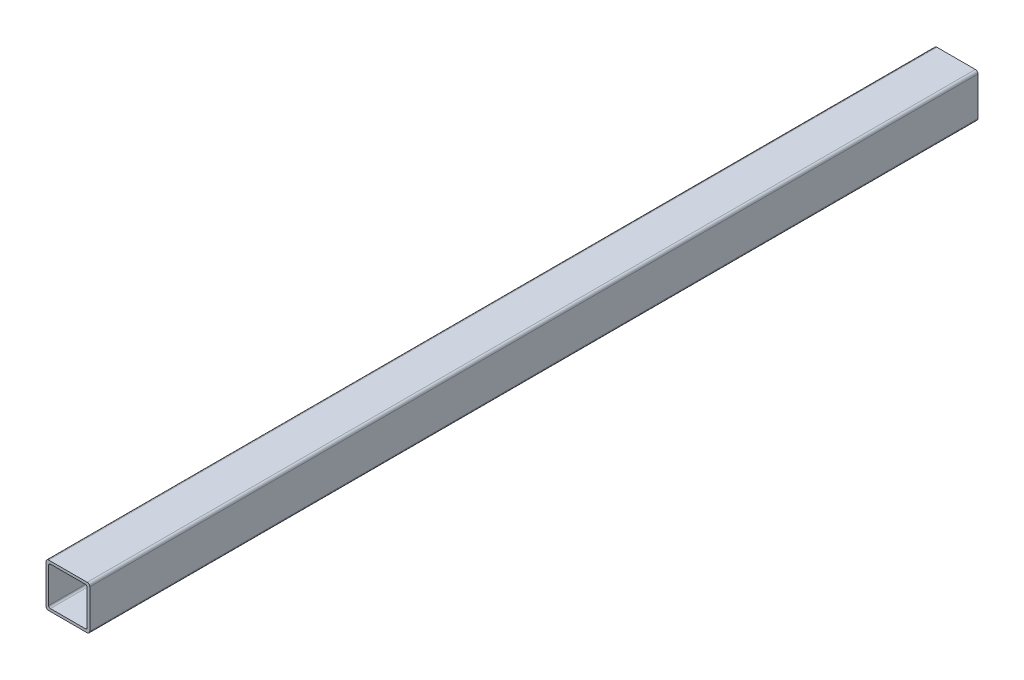
ISO-10303-21;
HEADER;
FILE_DESCRIPTION(('STEP AP214'),'2;1');
FILE_NAME('part.step','',(''),(''),'','','');
FILE_SCHEMA(('AUTOMOTIVE_DESIGN { 1 0 10303 214 1 1 1 1 }'));
ENDSEC;
DATA;
#1=APPLICATION_CONTEXT('core data for automotive mechanical design processes');
#2=APPLICATION_PROTOCOL_DEFINITION('international standard','automotive_design',2000,#1);
#3=PRODUCT_CONTEXT('',#1,'mechanical');
#4=PRODUCT('Part','Part','',(#3));
#5=PRODUCT_RELATED_PRODUCT_CATEGORY('part','',(#4));
#6=PRODUCT_DEFINITION_FORMATION('','',#4);
#7=PRODUCT_DEFINITION_CONTEXT('part definition',#1,'design');
#8=PRODUCT_DEFINITION('design','',#6,#7);
#9=PRODUCT_DEFINITION_SHAPE('','',#8);
#10=(LENGTH_UNIT() NAMED_UNIT(*) SI_UNIT(.MILLI.,.METRE.));
#11=(NAMED_UNIT(*) PLANE_ANGLE_UNIT() SI_UNIT($,.RADIAN.));
#12=(NAMED_UNIT(*) SI_UNIT($,.STERADIAN.) SOLID_ANGLE_UNIT());
#13=UNCERTAINTY_MEASURE_WITH_UNIT(LENGTH_MEASURE(1.E-05),#10,'distance_accuracy_value','');
#14=(GEOMETRIC_REPRESENTATION_CONTEXT(3) GLOBAL_UNCERTAINTY_ASSIGNED_CONTEXT((#13)) GLOBAL_UNIT_ASSIGNED_CONTEXT((#10,
#11,#12)) REPRESENTATION_CONTEXT('',''));
#15=CARTESIAN_POINT('',(0.,0.,0.));
#16=DIRECTION('',(0.,0.,1.));
#17=DIRECTION('',(1.,0.,0.));
#18=AXIS2_PLACEMENT_3D('',#15,#16,#17);
#19=CARTESIAN_POINT('',(-22.,-25.,-1085.71067811867));
#20=DIRECTION('',(0.,-1.,0.));
#21=DIRECTION('',(0.,0.,-1.));
#22=AXIS2_PLACEMENT_3D('',#19,#20,#21);
#23=PLANE('',#22);
#24=DIRECTION('',(-1.,0.,0.));
#25=VECTOR('',#24,1.);
#26=CARTESIAN_POINT('',(-22.,-25.,-1015.00000000002));
#27=LINE('',#26,#25);
#28=CARTESIAN_POINT('',(22.,-25.,-1015.00000000002));
#29=VERTEX_POINT('',#28);
#30=CARTESIAN_POINT('',(-22.,-25.,-1015.00000000002));
#31=VERTEX_POINT('',#30);
#32=EDGE_CURVE('E11',#29,#31,#27,.T.);
#33=ORIENTED_EDGE('',*,*,#32,.F.);
#34=DIRECTION('',(0.,0.,1.));
#35=VECTOR('',#34,1.);
#36=CARTESIAN_POINT('',(22.,-25.,-1085.71067811867));
#37=LINE('',#36,#35);
#38=CARTESIAN_POINT('',(22.,-25.,0.));
#39=VERTEX_POINT('',#38);
#40=EDGE_CURVE('E234',#29,#39,#37,.T.);
#41=ORIENTED_EDGE('',*,*,#40,.T.);
#42=DIRECTION('',(1.,0.,0.));
#43=VECTOR('',#42,1.);
#44=CARTESIAN_POINT('',(-22.,-25.,0.));
#45=LINE('',#44,#43);
#46=CARTESIAN_POINT('',(-22.,-25.,0.));
#47=VERTEX_POINT('',#46);
#48=EDGE_CURVE('E200',#47,#39,#45,.T.);
#49=ORIENTED_EDGE('',*,*,#48,.F.);
#50=DIRECTION('',(0.,0.,1.));
#51=VECTOR('',#50,1.);
#52=CARTESIAN_POINT('',(-22.,-25.,-1085.71067811867));
#53=LINE('',#52,#51);
#54=EDGE_CURVE('E221',#31,#47,#53,.T.);
#55=ORIENTED_EDGE('',*,*,#54,.F.);
#56=EDGE_LOOP('',(#33,#41,#49,#55));
#57=FACE_BOUND('',#56,.T.);
#58=ADVANCED_FACE('F35',(#57),#23,.T.);
#59=CARTESIAN_POINT('',(22.,-22.,-1085.71067811867));
#60=DIRECTION('',(0.,0.,1.));
#61=DIRECTION('',(1.,0.,0.));
#62=AXIS2_PLACEMENT_3D('',#59,#60,#61);
#63=CYLINDRICAL_SURFACE('',#62,3.);
#64=CARTESIAN_POINT('',(22.,-22.,-1015.00000000002));
#65=DIRECTION('',(0.,0.,1.));
#66=DIRECTION('',(1.,0.,0.));
#67=AXIS2_PLACEMENT_3D('',#64,#65,#66);
#68=CIRCLE('',#67,3.);
#69=CARTESIAN_POINT('',(25.,-22.,-1015.00000000002));
#70=VERTEX_POINT('',#69);
#71=EDGE_CURVE('E301',#70,#29,#68,.F.);
#72=ORIENTED_EDGE('',*,*,#71,.F.);
#73=DIRECTION('',(0.,0.,1.));
#74=VECTOR('',#73,1.);
#75=CARTESIAN_POINT('',(25.,-22.,-1085.71067811867));
#76=LINE('',#75,#74);
#77=CARTESIAN_POINT('',(25.,-22.,0.));
#78=VERTEX_POINT('',#77);
#79=EDGE_CURVE('E232',#70,#78,#76,.T.);
#80=ORIENTED_EDGE('',*,*,#79,.T.);
#81=CARTESIAN_POINT('',(22.,-22.,0.));
#82=DIRECTION('',(0.,0.,1.));
#83=DIRECTION('',(1.,0.,0.));
#84=AXIS2_PLACEMENT_3D('',#81,#82,#83);
#85=CIRCLE('',#84,3.);
#86=EDGE_CURVE('E203',#39,#78,#85,.T.);
#87=ORIENTED_EDGE('',*,*,#86,.F.);
#88=ORIENTED_EDGE('',*,*,#40,.F.);
#89=EDGE_LOOP('',(#72,#80,#87,#88));
#90=FACE_BOUND('',#89,.T.);
#91=ADVANCED_FACE('F325',(#90),#63,.T.);
#92=CARTESIAN_POINT('',(25.,22.,-1085.71067811867));
#93=DIRECTION('',(1.,0.,0.));
#94=DIRECTION('',(0.,0.,-1.));
#95=AXIS2_PLACEMENT_3D('',#92,#93,#94);
#96=PLANE('',#95);
#97=DIRECTION('',(0.,-1.,0.));
#98=VECTOR('',#97,1.);
#99=CARTESIAN_POINT('',(25.,22.,-1015.00000000002));
#100=LINE('',#99,#98);
#101=CARTESIAN_POINT('',(25.,22.,-1015.00000000002));
#102=VERTEX_POINT('',#101);
#103=EDGE_CURVE('E303',#102,#70,#100,.T.);
#104=ORIENTED_EDGE('',*,*,#103,.F.);
#105=DIRECTION('',(0.,0.,1.));
#106=VECTOR('',#105,1.);
#107=CARTESIAN_POINT('',(25.,22.,-1085.71067811867));
#108=LINE('',#107,#106);
#109=CARTESIAN_POINT('',(25.,22.,0.));
#110=VERTEX_POINT('',#109);
#111=EDGE_CURVE('E230',#102,#110,#108,.T.);
#112=ORIENTED_EDGE('',*,*,#111,.T.);
#113=DIRECTION('',(0.,1.,0.));
#114=VECTOR('',#113,1.);
#115=CARTESIAN_POINT('',(25.,22.,0.));
#116=LINE('',#115,#114);
#117=EDGE_CURVE('E206',#78,#110,#116,.T.);
#118=ORIENTED_EDGE('',*,*,#117,.F.);
#119=ORIENTED_EDGE('',*,*,#79,.F.);
#120=EDGE_LOOP('',(#104,#112,#118,#119));
#121=FACE_BOUND('',#120,.T.);
#122=ADVANCED_FACE('F322',(#121),#96,.T.);
#123=CARTESIAN_POINT('',(22.,22.,-1085.71067811867));
#124=DIRECTION('',(0.,0.,1.));
#125=DIRECTION('',(1.,0.,0.));
#126=AXIS2_PLACEMENT_3D('',#123,#124,#125);
#127=CYLINDRICAL_SURFACE('',#126,3.00000000000001);
#128=CARTESIAN_POINT('',(22.,22.,-1015.00000000002));
#129=DIRECTION('',(0.,0.,1.));
#130=DIRECTION('',(1.,0.,0.));
#131=AXIS2_PLACEMENT_3D('',#128,#129,#130);
#132=CIRCLE('',#131,3.00000000000001);
#133=CARTESIAN_POINT('',(22.,25.,-1015.00000000002));
#134=VERTEX_POINT('',#133);
#135=EDGE_CURVE('E305',#134,#102,#132,.F.);
#136=ORIENTED_EDGE('',*,*,#135,.F.);
#137=DIRECTION('',(0.,0.,1.));
#138=VECTOR('',#137,1.);
#139=CARTESIAN_POINT('',(22.,25.,-1085.71067811867));
#140=LINE('',#139,#138);
#141=CARTESIAN_POINT('',(22.,25.,0.));
#142=VERTEX_POINT('',#141);
#143=EDGE_CURVE('E228',#134,#142,#140,.T.);
#144=ORIENTED_EDGE('',*,*,#143,.T.);
#145=CARTESIAN_POINT('',(22.,22.,0.));
#146=DIRECTION('',(0.,0.,1.));
#147=DIRECTION('',(-1.,0.,0.));
#148=AXIS2_PLACEMENT_3D('',#145,#146,#147);
#149=CIRCLE('',#148,3.00000000000001);
#150=EDGE_CURVE('E209',#110,#142,#149,.T.);
#151=ORIENTED_EDGE('',*,*,#150,.F.);
#152=ORIENTED_EDGE('',*,*,#111,.F.);
#153=EDGE_LOOP('',(#136,#144,#151,#152));
#154=FACE_BOUND('',#153,.T.);
#155=ADVANCED_FACE('F315',(#154),#127,.T.);
#156=CARTESIAN_POINT('',(-22.,25.,-1085.71067811867));
#157=DIRECTION('',(0.,1.,0.));
#158=DIRECTION('',(-1.,0.,0.));
#159=AXIS2_PLACEMENT_3D('',#156,#157,#158);
#160=PLANE('',#159);
#161=DIRECTION('',(1.,0.,0.));
#162=VECTOR('',#161,1.);
#163=CARTESIAN_POINT('',(-22.,25.,-1015.00000000002));
#164=LINE('',#163,#162);
#165=CARTESIAN_POINT('',(-22.,25.,-1015.00000000002));
#166=VERTEX_POINT('',#165);
#167=EDGE_CURVE('E259',#166,#134,#164,.T.);
#168=ORIENTED_EDGE('',*,*,#167,.F.);
#169=DIRECTION('',(0.,0.,1.));
#170=VECTOR('',#169,1.);
#171=CARTESIAN_POINT('',(-22.,25.,-1085.71067811867));
#172=LINE('',#171,#170);
#173=CARTESIAN_POINT('',(-22.,25.,0.));
#174=VERTEX_POINT('',#173);
#175=EDGE_CURVE('E226',#166,#174,#172,.T.);
#176=ORIENTED_EDGE('',*,*,#175,.T.);
#177=DIRECTION('',(-1.,0.,0.));
#178=VECTOR('',#177,1.);
#179=CARTESIAN_POINT('',(-22.,25.,0.));
#180=LINE('',#179,#178);
#181=EDGE_CURVE('E212',#142,#174,#180,.T.);
#182=ORIENTED_EDGE('',*,*,#181,.F.);
#183=ORIENTED_EDGE('',*,*,#143,.F.);
#184=EDGE_LOOP('',(#168,#176,#182,#183));
#185=FACE_BOUND('',#184,.T.);
#186=ADVANCED_FACE('F318',(#185),#160,.T.);
#187=CARTESIAN_POINT('',(-22.,22.,-1085.71067811867));
#188=DIRECTION('',(0.,0.,1.));
#189=DIRECTION('',(1.,0.,0.));
#190=AXIS2_PLACEMENT_3D('',#187,#188,#189);
#191=CYLINDRICAL_SURFACE('',#190,3.);
#192=CARTESIAN_POINT('',(-22.,22.,-1015.00000000002));
#193=DIRECTION('',(0.,0.,1.));
#194=DIRECTION('',(1.,0.,0.));
#195=AXIS2_PLACEMENT_3D('',#192,#193,#194);
#196=CIRCLE('',#195,3.);
#197=CARTESIAN_POINT('',(-25.,22.,-1015.00000000002));
#198=VERTEX_POINT('',#197);
#199=EDGE_CURVE('E255',#198,#166,#196,.F.);
#200=ORIENTED_EDGE('',*,*,#199,.F.);
#201=DIRECTION('',(0.,0.,1.));
#202=VECTOR('',#201,1.);
#203=CARTESIAN_POINT('',(-25.,22.,-1085.71067811867));
#204=LINE('',#203,#202);
#205=CARTESIAN_POINT('',(-25.,22.,0.));
#206=VERTEX_POINT('',#205);
#207=EDGE_CURVE('E224',#198,#206,#204,.T.);
#208=ORIENTED_EDGE('',*,*,#207,.T.);
#209=CARTESIAN_POINT('',(-22.,22.,0.));
#210=DIRECTION('',(0.,0.,1.));
#211=DIRECTION('',(1.,0.,0.));
#212=AXIS2_PLACEMENT_3D('',#209,#210,#211);
#213=CIRCLE('',#212,3.);
#214=EDGE_CURVE('E215',#174,#206,#213,.T.);
#215=ORIENTED_EDGE('',*,*,#214,.F.);
#216=ORIENTED_EDGE('',*,*,#175,.F.);
#217=EDGE_LOOP('',(#200,#208,#215,#216));
#218=FACE_BOUND('',#217,.T.);
#219=ADVANCED_FACE('F338',(#218),#191,.T.);
#220=CARTESIAN_POINT('',(-25.,22.,-1085.71067811867));
#221=DIRECTION('',(-1.,0.,0.));
#222=DIRECTION('',(0.,0.,1.));
#223=AXIS2_PLACEMENT_3D('',#220,#221,#222);
#224=PLANE('',#223);
#225=DIRECTION('',(0.,1.,0.));
#226=VECTOR('',#225,1.);
#227=CARTESIAN_POINT('',(-25.,22.,-1015.00000000002));
#228=LINE('',#227,#226);
#229=CARTESIAN_POINT('',(-25.,-22.,-1015.00000000002));
#230=VERTEX_POINT('',#229);
#231=EDGE_CURVE('E252',#230,#198,#228,.T.);
#232=ORIENTED_EDGE('',*,*,#231,.F.);
#233=DIRECTION('',(0.,0.,1.));
#234=VECTOR('',#233,1.);
#235=CARTESIAN_POINT('',(-25.,-22.,-1085.71067811867));
#236=LINE('',#235,#234);
#237=CARTESIAN_POINT('',(-25.,-22.,0.));
#238=VERTEX_POINT('',#237);
#239=EDGE_CURVE('E222',#230,#238,#236,.T.);
#240=ORIENTED_EDGE('',*,*,#239,.T.);
#241=DIRECTION('',(0.,-1.,0.));
#242=VECTOR('',#241,1.);
#243=CARTESIAN_POINT('',(-25.,22.,0.));
#244=LINE('',#243,#242);
#245=EDGE_CURVE('E218',#206,#238,#244,.T.);
#246=ORIENTED_EDGE('',*,*,#245,.F.);
#247=ORIENTED_EDGE('',*,*,#207,.F.);
#248=EDGE_LOOP('',(#232,#240,#246,#247));
#249=FACE_BOUND('',#248,.T.);
#250=ADVANCED_FACE('F251',(#249),#224,.T.);
#251=CARTESIAN_POINT('',(-22.,-22.,-1085.71067811867));
#252=DIRECTION('',(0.,0.,1.));
#253=DIRECTION('',(1.,0.,0.));
#254=AXIS2_PLACEMENT_3D('',#251,#252,#253);
#255=CYLINDRICAL_SURFACE('',#254,3.);
#256=CARTESIAN_POINT('',(-22.,-22.,-1015.00000000002));
#257=DIRECTION('',(0.,0.,1.));
#258=DIRECTION('',(1.,0.,0.));
#259=AXIS2_PLACEMENT_3D('',#256,#257,#258);
#260=CIRCLE('',#259,3.);
#261=EDGE_CURVE('E241',#31,#230,#260,.F.);
#262=ORIENTED_EDGE('',*,*,#261,.F.);
#263=ORIENTED_EDGE('',*,*,#54,.T.);
#264=CARTESIAN_POINT('',(-22.,-22.,0.));
#265=DIRECTION('',(0.,0.,1.));
#266=DIRECTION('',(1.,0.,0.));
#267=AXIS2_PLACEMENT_3D('',#264,#265,#266);
#268=CIRCLE('',#267,3.);
#269=EDGE_CURVE('E187',#238,#47,#268,.T.);
#270=ORIENTED_EDGE('',*,*,#269,.F.);
#271=ORIENTED_EDGE('',*,*,#239,.F.);
#272=EDGE_LOOP('',(#262,#263,#270,#271));
#273=FACE_BOUND('',#272,.T.);
#274=ADVANCED_FACE('F37',(#273),#255,.T.);
#275=CARTESIAN_POINT('',(-22.,-22.,0.));
#276=DIRECTION('',(0.,0.,1.));
#277=DIRECTION('',(1.,0.,0.));
#278=AXIS2_PLACEMENT_3D('',#275,#276,#277);
#279=PLANE('',#278);
#280=CARTESIAN_POINT('',(-20.,-20.,0.));
#281=DIRECTION('',(0.,0.,1.));
#282=DIRECTION('',(1.,0.,0.));
#283=AXIS2_PLACEMENT_3D('',#280,#281,#282);
#284=CIRCLE('',#283,2.);
#285=CARTESIAN_POINT('',(-22.,-20.,0.));
#286=VERTEX_POINT('',#285);
#287=CARTESIAN_POINT('',(-20.,-22.,0.));
#288=VERTEX_POINT('',#287);
#289=EDGE_CURVE('E162',#286,#288,#284,.T.);
#290=ORIENTED_EDGE('',*,*,#289,.F.);
#291=DIRECTION('',(0.,-1.,0.));
#292=VECTOR('',#291,1.);
#293=CARTESIAN_POINT('',(-22.,20.,0.));
#294=LINE('',#293,#292);
#295=CARTESIAN_POINT('',(-22.,20.,0.));
#296=VERTEX_POINT('',#295);
#297=EDGE_CURVE('E182',#296,#286,#294,.T.);
#298=ORIENTED_EDGE('',*,*,#297,.F.);
#299=CARTESIAN_POINT('',(-20.,20.,0.));
#300=DIRECTION('',(0.,0.,1.));
#301=DIRECTION('',(1.,0.,0.));
#302=AXIS2_PLACEMENT_3D('',#299,#300,#301);
#303=CIRCLE('',#302,2.);
#304=CARTESIAN_POINT('',(-20.,22.,0.));
#305=VERTEX_POINT('',#304);
#306=EDGE_CURVE('E179',#305,#296,#303,.T.);
#307=ORIENTED_EDGE('',*,*,#306,.F.);
#308=DIRECTION('',(-1.,0.,0.));
#309=VECTOR('',#308,1.);
#310=CARTESIAN_POINT('',(-20.,22.,0.));
#311=LINE('',#310,#309);
#312=CARTESIAN_POINT('',(20.,22.,0.));
#313=VERTEX_POINT('',#312);
#314=EDGE_CURVE('E176',#313,#305,#311,.T.);
#315=ORIENTED_EDGE('',*,*,#314,.F.);
#316=CARTESIAN_POINT('',(20.,20.,0.));
#317=DIRECTION('',(0.,0.,1.));
#318=DIRECTION('',(-1.,0.,0.));
#319=AXIS2_PLACEMENT_3D('',#316,#317,#318);
#320=CIRCLE('',#319,2.);
#321=CARTESIAN_POINT('',(22.,20.,0.));
#322=VERTEX_POINT('',#321);
#323=EDGE_CURVE('E170',#322,#313,#320,.T.);
#324=ORIENTED_EDGE('',*,*,#323,.F.);
#325=DIRECTION('',(0.,1.,0.));
#326=VECTOR('',#325,1.);
#327=CARTESIAN_POINT('',(22.,20.,0.));
#328=LINE('',#327,#326);
#329=CARTESIAN_POINT('',(22.,-20.,0.));
#330=VERTEX_POINT('',#329);
#331=EDGE_CURVE('E168',#330,#322,#328,.T.);
#332=ORIENTED_EDGE('',*,*,#331,.F.);
#333=CARTESIAN_POINT('',(20.,-20.,0.));
#334=DIRECTION('',(0.,0.,1.));
#335=DIRECTION('',(1.,0.,0.));
#336=AXIS2_PLACEMENT_3D('',#333,#334,#335);
#337=CIRCLE('',#336,2.);
#338=CARTESIAN_POINT('',(20.,-22.,0.));
#339=VERTEX_POINT('',#338);
#340=EDGE_CURVE('E149',#339,#330,#337,.T.);
#341=ORIENTED_EDGE('',*,*,#340,.F.);
#342=DIRECTION('',(1.,0.,0.));
#343=VECTOR('',#342,1.);
#344=CARTESIAN_POINT('',(-20.,-22.,0.));
#345=LINE('',#344,#343);
#346=EDGE_CURVE('E156',#288,#339,#345,.T.);
#347=ORIENTED_EDGE('',*,*,#346,.F.);
#348=EDGE_LOOP('',(#290,#298,#307,#315,#324,#332,#341,#347));
#349=FACE_BOUND('',#348,.T.);
#350=ORIENTED_EDGE('',*,*,#269,.T.);
#351=ORIENTED_EDGE('',*,*,#48,.T.);
#352=ORIENTED_EDGE('',*,*,#86,.T.);
#353=ORIENTED_EDGE('',*,*,#117,.T.);
#354=ORIENTED_EDGE('',*,*,#150,.T.);
#355=ORIENTED_EDGE('',*,*,#181,.T.);
#356=ORIENTED_EDGE('',*,*,#214,.T.);
#357=ORIENTED_EDGE('',*,*,#245,.T.);
#358=EDGE_LOOP('',(#350,#351,#352,#353,#354,#355,#356,#357));
#359=FACE_BOUND('',#358,.T.);
#360=ADVANCED_FACE('F164',(#349,#359),#279,.T.);
#361=CARTESIAN_POINT('',(-20.,-22.,-1085.71067811867));
#362=DIRECTION('',(0.,-1.,0.));
#363=DIRECTION('',(0.,0.,-1.));
#364=AXIS2_PLACEMENT_3D('',#361,#362,#363);
#365=PLANE('',#364);
#366=DIRECTION('',(0.,0.,1.));
#367=VECTOR('',#366,1.);
#368=CARTESIAN_POINT('',(20.,-22.,-1085.71067811867));
#369=LINE('',#368,#367);
#370=CARTESIAN_POINT('',(20.,-22.,-1015.00000000002));
#371=VERTEX_POINT('',#370);
#372=EDGE_CURVE('E145',#371,#339,#369,.T.);
#373=ORIENTED_EDGE('',*,*,#372,.F.);
#374=DIRECTION('',(-1.,0.,0.));
#375=VECTOR('',#374,1.);
#376=CARTESIAN_POINT('',(-20.,-22.,-1015.00000000002));
#377=LINE('',#376,#375);
#378=CARTESIAN_POINT('',(-20.,-22.,-1015.00000000002));
#379=VERTEX_POINT('',#378);
#380=EDGE_CURVE('E39',#371,#379,#377,.T.);
#381=ORIENTED_EDGE('',*,*,#380,.T.);
#382=DIRECTION('',(0.,0.,1.));
#383=VECTOR('',#382,1.);
#384=CARTESIAN_POINT('',(-20.,-22.,-1085.71067811867));
#385=LINE('',#384,#383);
#386=EDGE_CURVE('E153',#379,#288,#385,.T.);
#387=ORIENTED_EDGE('',*,*,#386,.T.);
#388=ORIENTED_EDGE('',*,*,#346,.T.);
#389=EDGE_LOOP('',(#373,#381,#387,#388));
#390=FACE_BOUND('',#389,.T.);
#391=ADVANCED_FACE('F157',(#390),#365,.F.);
#392=CARTESIAN_POINT('',(20.,-20.,-1085.71067811867));
#393=DIRECTION('',(0.,0.,1.));
#394=DIRECTION('',(1.,0.,0.));
#395=AXIS2_PLACEMENT_3D('',#392,#393,#394);
#396=CYLINDRICAL_SURFACE('',#395,2.);
#397=DIRECTION('',(0.,0.,1.));
#398=VECTOR('',#397,1.);
#399=CARTESIAN_POINT('',(22.,-20.,-1085.71067811867));
#400=LINE('',#399,#398);
#401=CARTESIAN_POINT('',(22.,-20.,-1015.00000000002));
#402=VERTEX_POINT('',#401);
#403=EDGE_CURVE('E152',#402,#330,#400,.T.);
#404=ORIENTED_EDGE('',*,*,#403,.F.);
#405=CARTESIAN_POINT('',(20.,-20.,-1015.00000000002));
#406=DIRECTION('',(0.,0.,1.));
#407=DIRECTION('',(1.,0.,0.));
#408=AXIS2_PLACEMENT_3D('',#405,#406,#407);
#409=CIRCLE('',#408,2.);
#410=EDGE_CURVE('E44',#402,#371,#409,.F.);
#411=ORIENTED_EDGE('',*,*,#410,.T.);
#412=ORIENTED_EDGE('',*,*,#372,.T.);
#413=ORIENTED_EDGE('',*,*,#340,.T.);
#414=EDGE_LOOP('',(#404,#411,#412,#413));
#415=FACE_BOUND('',#414,.T.);
#416=ADVANCED_FACE('F147',(#415),#396,.F.);
#417=CARTESIAN_POINT('',(22.,20.,-1085.71067811867));
#418=DIRECTION('',(1.,0.,0.));
#419=DIRECTION('',(0.,0.,-1.));
#420=AXIS2_PLACEMENT_3D('',#417,#418,#419);
#421=PLANE('',#420);
#422=DIRECTION('',(0.,0.,1.));
#423=VECTOR('',#422,1.);
#424=CARTESIAN_POINT('',(22.,20.,-1085.71067811867));
#425=LINE('',#424,#423);
#426=CARTESIAN_POINT('',(22.,20.,-1015.00000000002));
#427=VERTEX_POINT('',#426);
#428=EDGE_CURVE('E194',#427,#322,#425,.T.);
#429=ORIENTED_EDGE('',*,*,#428,.F.);
#430=DIRECTION('',(0.,-1.,0.));
#431=VECTOR('',#430,1.);
#432=CARTESIAN_POINT('',(22.,20.,-1015.00000000002));
#433=LINE('',#432,#431);
#434=EDGE_CURVE('E291',#427,#402,#433,.T.);
#435=ORIENTED_EDGE('',*,*,#434,.T.);
#436=ORIENTED_EDGE('',*,*,#403,.T.);
#437=ORIENTED_EDGE('',*,*,#331,.T.);
#438=EDGE_LOOP('',(#429,#435,#436,#437));
#439=FACE_BOUND('',#438,.T.);
#440=ADVANCED_FACE('F290',(#439),#421,.F.);
#441=CARTESIAN_POINT('',(20.,20.,-1085.71067811867));
#442=DIRECTION('',(0.,0.,1.));
#443=DIRECTION('',(1.,0.,0.));
#444=AXIS2_PLACEMENT_3D('',#441,#442,#443);
#445=CYLINDRICAL_SURFACE('',#444,2.);
#446=DIRECTION('',(0.,0.,1.));
#447=VECTOR('',#446,1.);
#448=CARTESIAN_POINT('',(20.,22.,-1085.71067811867));
#449=LINE('',#448,#447);
#450=CARTESIAN_POINT('',(20.,22.,-1015.00000000002));
#451=VERTEX_POINT('',#450);
#452=EDGE_CURVE('E192',#451,#313,#449,.T.);
#453=ORIENTED_EDGE('',*,*,#452,.F.);
#454=CARTESIAN_POINT('',(20.,20.,-1015.00000000002));
#455=DIRECTION('',(0.,0.,1.));
#456=DIRECTION('',(1.,0.,0.));
#457=AXIS2_PLACEMENT_3D('',#454,#455,#456);
#458=CIRCLE('',#457,2.);
#459=EDGE_CURVE('E287',#451,#427,#458,.F.);
#460=ORIENTED_EDGE('',*,*,#459,.T.);
#461=ORIENTED_EDGE('',*,*,#428,.T.);
#462=ORIENTED_EDGE('',*,*,#323,.T.);
#463=EDGE_LOOP('',(#453,#460,#461,#462));
#464=FACE_BOUND('',#463,.T.);
#465=ADVANCED_FACE('F284',(#464),#445,.F.);
#466=CARTESIAN_POINT('',(-20.,22.,-1085.71067811867));
#467=DIRECTION('',(0.,1.,0.));
#468=DIRECTION('',(0.,0.,1.));
#469=AXIS2_PLACEMENT_3D('',#466,#467,#468);
#470=PLANE('',#469);
#471=DIRECTION('',(0.,0.,1.));
#472=VECTOR('',#471,1.);
#473=CARTESIAN_POINT('',(-20.,22.,-1085.71067811867));
#474=LINE('',#473,#472);
#475=CARTESIAN_POINT('',(-20.,22.,-1015.00000000002));
#476=VERTEX_POINT('',#475);
#477=EDGE_CURVE('E190',#476,#305,#474,.T.);
#478=ORIENTED_EDGE('',*,*,#477,.F.);
#479=DIRECTION('',(1.,0.,0.));
#480=VECTOR('',#479,1.);
#481=CARTESIAN_POINT('',(-20.,22.,-1015.00000000002));
#482=LINE('',#481,#480);
#483=EDGE_CURVE('E294',#476,#451,#482,.T.);
#484=ORIENTED_EDGE('',*,*,#483,.T.);
#485=ORIENTED_EDGE('',*,*,#452,.T.);
#486=ORIENTED_EDGE('',*,*,#314,.T.);
#487=EDGE_LOOP('',(#478,#484,#485,#486));
#488=FACE_BOUND('',#487,.T.);
#489=ADVANCED_FACE('F281',(#488),#470,.F.);
#490=CARTESIAN_POINT('',(-20.,20.,-1085.71067811867));
#491=DIRECTION('',(0.,0.,1.));
#492=DIRECTION('',(1.,0.,0.));
#493=AXIS2_PLACEMENT_3D('',#490,#491,#492);
#494=CYLINDRICAL_SURFACE('',#493,2.);
#495=DIRECTION('',(0.,0.,1.));
#496=VECTOR('',#495,1.);
#497=CARTESIAN_POINT('',(-22.,20.,-1085.71067811867));
#498=LINE('',#497,#496);
#499=CARTESIAN_POINT('',(-22.,20.,-1015.00000000002));
#500=VERTEX_POINT('',#499);
#501=EDGE_CURVE('E188',#500,#296,#498,.T.);
#502=ORIENTED_EDGE('',*,*,#501,.F.);
#503=CARTESIAN_POINT('',(-20.,20.,-1015.00000000002));
#504=DIRECTION('',(0.,0.,1.));
#505=DIRECTION('',(1.,0.,0.));
#506=AXIS2_PLACEMENT_3D('',#503,#504,#505);
#507=CIRCLE('',#506,2.);
#508=EDGE_CURVE('E278',#500,#476,#507,.F.);
#509=ORIENTED_EDGE('',*,*,#508,.T.);
#510=ORIENTED_EDGE('',*,*,#477,.T.);
#511=ORIENTED_EDGE('',*,*,#306,.T.);
#512=EDGE_LOOP('',(#502,#509,#510,#511));
#513=FACE_BOUND('',#512,.T.);
#514=ADVANCED_FACE('F276',(#513),#494,.F.);
#515=CARTESIAN_POINT('',(-22.,20.,-1085.71067811867));
#516=DIRECTION('',(-1.,0.,0.));
#517=DIRECTION('',(0.,0.,1.));
#518=AXIS2_PLACEMENT_3D('',#515,#516,#517);
#519=PLANE('',#518);
#520=DIRECTION('',(0.,0.,1.));
#521=VECTOR('',#520,1.);
#522=CARTESIAN_POINT('',(-22.,-20.,-1085.71067811867));
#523=LINE('',#522,#521);
#524=CARTESIAN_POINT('',(-22.,-20.,-1015.00000000002));
#525=VERTEX_POINT('',#524);
#526=EDGE_CURVE('E185',#525,#286,#523,.T.);
#527=ORIENTED_EDGE('',*,*,#526,.F.);
#528=DIRECTION('',(0.,1.,0.));
#529=VECTOR('',#528,1.);
#530=CARTESIAN_POINT('',(-22.,20.,-1015.00000000002));
#531=LINE('',#530,#529);
#532=EDGE_CURVE('E273',#525,#500,#531,.T.);
#533=ORIENTED_EDGE('',*,*,#532,.T.);
#534=ORIENTED_EDGE('',*,*,#501,.T.);
#535=ORIENTED_EDGE('',*,*,#297,.T.);
#536=EDGE_LOOP('',(#527,#533,#534,#535));
#537=FACE_BOUND('',#536,.T.);
#538=ADVANCED_FACE('F270',(#537),#519,.F.);
#539=CARTESIAN_POINT('',(-20.,-20.,-1085.71067811867));
#540=DIRECTION('',(0.,0.,1.));
#541=DIRECTION('',(1.,0.,0.));
#542=AXIS2_PLACEMENT_3D('',#539,#540,#541);
#543=CYLINDRICAL_SURFACE('',#542,2.);
#544=ORIENTED_EDGE('',*,*,#386,.F.);
#545=CARTESIAN_POINT('',(-20.,-20.,-1015.00000000002));
#546=DIRECTION('',(0.,0.,1.));
#547=DIRECTION('',(1.,0.,0.));
#548=AXIS2_PLACEMENT_3D('',#545,#546,#547);
#549=CIRCLE('',#548,2.);
#550=EDGE_CURVE('E257',#379,#525,#549,.F.);
#551=ORIENTED_EDGE('',*,*,#550,.T.);
#552=ORIENTED_EDGE('',*,*,#526,.T.);
#553=ORIENTED_EDGE('',*,*,#289,.T.);
#554=EDGE_LOOP('',(#544,#551,#552,#553));
#555=FACE_BOUND('',#554,.T.);
#556=ADVANCED_FACE('F263',(#555),#543,.F.);
#557=CARTESIAN_POINT('',(-22.,-300.,-1015.00000000002));
#558=DIRECTION('',(0.,0.,1.));
#559=DIRECTION('',(1.,0.,0.));
#560=AXIS2_PLACEMENT_3D('',#557,#558,#559);
#561=PLANE('',#560);
#562=ORIENTED_EDGE('',*,*,#261,.T.);
#563=ORIENTED_EDGE('',*,*,#231,.T.);
#564=ORIENTED_EDGE('',*,*,#199,.T.);
#565=ORIENTED_EDGE('',*,*,#167,.T.);
#566=ORIENTED_EDGE('',*,*,#135,.T.);
#567=ORIENTED_EDGE('',*,*,#103,.T.);
#568=ORIENTED_EDGE('',*,*,#71,.T.);
#569=ORIENTED_EDGE('',*,*,#32,.T.);
#570=EDGE_LOOP('',(#562,#563,#564,#565,#566,#567,#568,#569));
#571=FACE_BOUND('',#570,.T.);
#572=ORIENTED_EDGE('',*,*,#380,.F.);
#573=ORIENTED_EDGE('',*,*,#410,.F.);
#574=ORIENTED_EDGE('',*,*,#434,.F.);
#575=ORIENTED_EDGE('',*,*,#459,.F.);
#576=ORIENTED_EDGE('',*,*,#483,.F.);
#577=ORIENTED_EDGE('',*,*,#508,.F.);
#578=ORIENTED_EDGE('',*,*,#532,.F.);
#579=ORIENTED_EDGE('',*,*,#550,.F.);
#580=EDGE_LOOP('',(#572,#573,#574,#575,#576,#577,#578,#579));
#581=FACE_BOUND('',#580,.T.);
#582=ADVANCED_FACE('F308',(#571,#581),#561,.F.);
#583=CLOSED_SHELL('',(#58,#91,#122,#155,#186,#219,#250,#274,#360,#391,#416,#440,#465,#489,#514,
#538,#556,#582));
#584=MANIFOLD_SOLID_BREP('B2',#583);
#585=ADVANCED_BREP_SHAPE_REPRESENTATION('',(#18,#584),#14);
#586=SHAPE_DEFINITION_REPRESENTATION(#9,#585);
ENDSEC;
END-ISO-10303-21;
